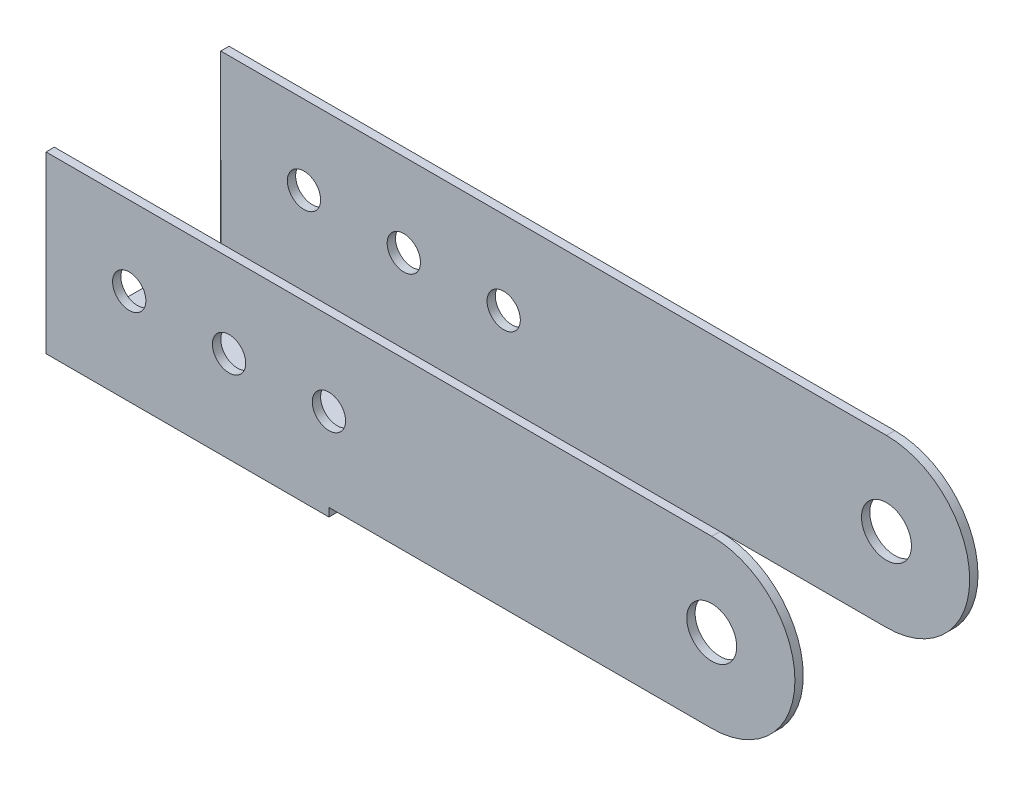
ISO-10303-21;
HEADER;
FILE_DESCRIPTION(('STEP AP214'),'2;1');
FILE_NAME('part.step','',(''),(''),'','','');
FILE_SCHEMA(('AUTOMOTIVE_DESIGN { 1 0 10303 214 1 1 1 1 }'));
ENDSEC;
DATA;
#1=APPLICATION_CONTEXT('core data for automotive mechanical design processes');
#2=APPLICATION_PROTOCOL_DEFINITION('international standard','automotive_design',2000,#1);
#3=PRODUCT_CONTEXT('',#1,'mechanical');
#4=PRODUCT('Part','Part','',(#3));
#5=PRODUCT_RELATED_PRODUCT_CATEGORY('part','',(#4));
#6=PRODUCT_DEFINITION_FORMATION('','',#4);
#7=PRODUCT_DEFINITION_CONTEXT('part definition',#1,'design');
#8=PRODUCT_DEFINITION('design','',#6,#7);
#9=PRODUCT_DEFINITION_SHAPE('','',#8);
#10=(LENGTH_UNIT() NAMED_UNIT(*) SI_UNIT(.MILLI.,.METRE.));
#11=(NAMED_UNIT(*) PLANE_ANGLE_UNIT() SI_UNIT($,.RADIAN.));
#12=(NAMED_UNIT(*) SI_UNIT($,.STERADIAN.) SOLID_ANGLE_UNIT());
#13=UNCERTAINTY_MEASURE_WITH_UNIT(LENGTH_MEASURE(1.E-05),#10,'distance_accuracy_value','');
#14=(GEOMETRIC_REPRESENTATION_CONTEXT(3) GLOBAL_UNCERTAINTY_ASSIGNED_CONTEXT((#13)) GLOBAL_UNIT_ASSIGNED_CONTEXT((#10,
#11,#12)) REPRESENTATION_CONTEXT('',''));
#15=CARTESIAN_POINT('',(0.,0.,0.));
#16=DIRECTION('',(0.,0.,1.));
#17=DIRECTION('',(1.,0.,0.));
#18=AXIS2_PLACEMENT_3D('',#15,#16,#17);
#19=CARTESIAN_POINT('',(-25.,-5.,10.5));
#20=DIRECTION('',(0.,1.,0.));
#21=DIRECTION('',(-1.,0.,0.));
#22=AXIS2_PLACEMENT_3D('',#19,#20,#21);
#23=PLANE('',#22);
#24=DIRECTION('',(0.,0.,1.));
#25=VECTOR('',#24,1.);
#26=CARTESIAN_POINT('',(-8.,-5.,10.5));
#27=LINE('',#26,#25);
#28=CARTESIAN_POINT('',(-8.,-5.,10.));
#29=VERTEX_POINT('',#28);
#30=CARTESIAN_POINT('',(-8.,-5.,10.5));
#31=VERTEX_POINT('',#30);
#32=EDGE_CURVE('E11',#29,#31,#27,.T.);
#33=ORIENTED_EDGE('',*,*,#32,.F.);
#34=DIRECTION('',(1.,0.,0.));
#35=VECTOR('',#34,1.);
#36=CARTESIAN_POINT('',(-25.,-5.,10.));
#37=LINE('',#36,#35);
#38=CARTESIAN_POINT('',(15.,-5.,10.));
#39=VERTEX_POINT('',#38);
#40=EDGE_CURVE('E220',#29,#39,#37,.T.);
#41=ORIENTED_EDGE('',*,*,#40,.T.);
#42=DIRECTION('',(0.,0.,-1.));
#43=VECTOR('',#42,1.);
#44=CARTESIAN_POINT('',(15.,-5.,10.5));
#45=LINE('',#44,#43);
#46=CARTESIAN_POINT('',(15.,-5.,10.5));
#47=VERTEX_POINT('',#46);
#48=EDGE_CURVE('E43',#47,#39,#45,.T.);
#49=ORIENTED_EDGE('',*,*,#48,.F.);
#50=DIRECTION('',(1.,0.,0.));
#51=VECTOR('',#50,1.);
#52=CARTESIAN_POINT('',(-25.,-5.,10.5));
#53=LINE('',#52,#51);
#54=EDGE_CURVE('E50',#31,#47,#53,.T.);
#55=ORIENTED_EDGE('',*,*,#54,.F.);
#56=EDGE_LOOP('',(#33,#41,#49,#55));
#57=FACE_BOUND('',#56,.T.);
#58=ADVANCED_FACE('F35',(#57),#23,.F.);
#59=CARTESIAN_POINT('',(15.,0.,10.5));
#60=DIRECTION('',(0.,0.,1.));
#61=DIRECTION('',(1.,0.,0.));
#62=AXIS2_PLACEMENT_3D('',#59,#60,#61);
#63=PLANE('',#62);
#64=CARTESIAN_POINT('',(-14.,0.,10.5));
#65=DIRECTION('',(0.,0.,1.));
#66=DIRECTION('',(1.,0.,0.));
#67=AXIS2_PLACEMENT_3D('',#64,#65,#66);
#68=CIRCLE('',#67,1.);
#69=CARTESIAN_POINT('',(-13.,0.,10.5));
#70=VERTEX_POINT('',#69);
#71=EDGE_CURVE('E192',#70,#70,#68,.T.);
#72=ORIENTED_EDGE('',*,*,#71,.F.);
#73=EDGE_LOOP('',(#72));
#74=FACE_BOUND('',#73,.T.);
#75=CARTESIAN_POINT('',(15.,0.,10.5));
#76=DIRECTION('',(0.,0.,1.));
#77=DIRECTION('',(1.,0.,0.));
#78=AXIS2_PLACEMENT_3D('',#75,#76,#77);
#79=CIRCLE('',#78,1.5);
#80=CARTESIAN_POINT('',(16.5,0.,10.5));
#81=VERTEX_POINT('',#80);
#82=EDGE_CURVE('E204',#81,#81,#79,.T.);
#83=ORIENTED_EDGE('',*,*,#82,.F.);
#84=EDGE_LOOP('',(#83));
#85=FACE_BOUND('',#84,.T.);
#86=DIRECTION('',(0.,-1.,0.));
#87=VECTOR('',#86,1.);
#88=CARTESIAN_POINT('',(-25.,5.,10.5));
#89=LINE('',#88,#87);
#90=CARTESIAN_POINT('',(-25.,5.,10.5));
#91=VERTEX_POINT('',#90);
#92=CARTESIAN_POINT('',(-25.,-5.5,10.5));
#93=VERTEX_POINT('',#92);
#94=EDGE_CURVE('E210',#91,#93,#89,.T.);
#95=ORIENTED_EDGE('',*,*,#94,.T.);
#96=DIRECTION('',(-1.,0.,0.));
#97=VECTOR('',#96,1.);
#98=CARTESIAN_POINT('',(-25.,-5.5,10.5));
#99=LINE('',#98,#97);
#100=CARTESIAN_POINT('',(-8.,-5.5,10.5));
#101=VERTEX_POINT('',#100);
#102=EDGE_CURVE('E166',#101,#93,#99,.T.);
#103=ORIENTED_EDGE('',*,*,#102,.F.);
#104=DIRECTION('',(0.,1.,0.));
#105=VECTOR('',#104,1.);
#106=CARTESIAN_POINT('',(-8.,-5.5,10.5));
#107=LINE('',#106,#105);
#108=EDGE_CURVE('E182',#101,#31,#107,.T.);
#109=ORIENTED_EDGE('',*,*,#108,.T.);
#110=ORIENTED_EDGE('',*,*,#54,.T.);
#111=CARTESIAN_POINT('',(15.,0.,10.5));
#112=DIRECTION('',(0.,0.,1.));
#113=DIRECTION('',(1.,0.,0.));
#114=AXIS2_PLACEMENT_3D('',#111,#112,#113);
#115=CIRCLE('',#114,5.);
#116=CARTESIAN_POINT('',(15.,5.,10.5));
#117=VERTEX_POINT('',#116);
#118=EDGE_CURVE('E214',#47,#117,#115,.T.);
#119=ORIENTED_EDGE('',*,*,#118,.T.);
#120=DIRECTION('',(-1.,0.,0.));
#121=VECTOR('',#120,1.);
#122=CARTESIAN_POINT('',(15.,5.,10.5));
#123=LINE('',#122,#121);
#124=EDGE_CURVE('E216',#117,#91,#123,.T.);
#125=ORIENTED_EDGE('',*,*,#124,.T.);
#126=EDGE_LOOP('',(#95,#103,#109,#110,#119,#125));
#127=FACE_BOUND('',#126,.T.);
#128=CARTESIAN_POINT('',(-8.,0.,10.5));
#129=DIRECTION('',(0.,0.,1.));
#130=DIRECTION('',(1.,0.,0.));
#131=AXIS2_PLACEMENT_3D('',#128,#129,#130);
#132=CIRCLE('',#131,1.);
#133=CARTESIAN_POINT('',(-7.,0.,10.5));
#134=VERTEX_POINT('',#133);
#135=EDGE_CURVE('E198',#134,#134,#132,.T.);
#136=ORIENTED_EDGE('',*,*,#135,.F.);
#137=EDGE_LOOP('',(#136));
#138=FACE_BOUND('',#137,.T.);
#139=CARTESIAN_POINT('',(-20.,0.253438211378563,10.5));
#140=DIRECTION('',(0.,0.,1.));
#141=DIRECTION('',(1.,0.,0.));
#142=AXIS2_PLACEMENT_3D('',#139,#140,#141);
#143=CIRCLE('',#142,1.);
#144=CARTESIAN_POINT('',(-19.,0.253438211378563,10.5));
#145=VERTEX_POINT('',#144);
#146=EDGE_CURVE('E186',#145,#145,#143,.T.);
#147=ORIENTED_EDGE('',*,*,#146,.F.);
#148=EDGE_LOOP('',(#147));
#149=FACE_BOUND('',#148,.T.);
#150=ADVANCED_FACE('F252',(#74,#85,#127,#138,#149),#63,.T.);
#151=CARTESIAN_POINT('',(15.,0.,10.));
#152=DIRECTION('',(0.,0.,1.));
#153=DIRECTION('',(1.,0.,0.));
#154=AXIS2_PLACEMENT_3D('',#151,#152,#153);
#155=PLANE('',#154);
#156=DIRECTION('',(0.,-1.,0.));
#157=VECTOR('',#156,1.);
#158=CARTESIAN_POINT('',(-25.,5.,10.));
#159=LINE('',#158,#157);
#160=CARTESIAN_POINT('',(-25.,5.,10.));
#161=VERTEX_POINT('',#160);
#162=CARTESIAN_POINT('',(-25.,-5.,10.));
#163=VERTEX_POINT('',#162);
#164=EDGE_CURVE('E207',#161,#163,#159,.T.);
#165=ORIENTED_EDGE('',*,*,#164,.F.);
#166=DIRECTION('',(-1.,0.,0.));
#167=VECTOR('',#166,1.);
#168=CARTESIAN_POINT('',(15.,5.,10.));
#169=LINE('',#168,#167);
#170=CARTESIAN_POINT('',(15.,5.,10.));
#171=VERTEX_POINT('',#170);
#172=EDGE_CURVE('E212',#171,#161,#169,.T.);
#173=ORIENTED_EDGE('',*,*,#172,.F.);
#174=CARTESIAN_POINT('',(15.,0.,10.));
#175=DIRECTION('',(0.,0.,1.));
#176=DIRECTION('',(1.,0.,0.));
#177=AXIS2_PLACEMENT_3D('',#174,#175,#176);
#178=CIRCLE('',#177,5.);
#179=EDGE_CURVE('E224',#39,#171,#178,.T.);
#180=ORIENTED_EDGE('',*,*,#179,.F.);
#181=ORIENTED_EDGE('',*,*,#40,.F.);
#182=EDGE_CURVE('E221',#163,#29,#37,.T.);
#183=ORIENTED_EDGE('',*,*,#182,.F.);
#184=EDGE_LOOP('',(#165,#173,#180,#181,#183));
#185=FACE_BOUND('',#184,.T.);
#186=CARTESIAN_POINT('',(15.,0.,10.));
#187=DIRECTION('',(0.,0.,1.));
#188=DIRECTION('',(1.,0.,0.));
#189=AXIS2_PLACEMENT_3D('',#186,#187,#188);
#190=CIRCLE('',#189,1.5);
#191=CARTESIAN_POINT('',(16.5,0.,10.));
#192=VERTEX_POINT('',#191);
#193=EDGE_CURVE('E201',#192,#192,#190,.T.);
#194=ORIENTED_EDGE('',*,*,#193,.T.);
#195=EDGE_LOOP('',(#194));
#196=FACE_BOUND('',#195,.T.);
#197=CARTESIAN_POINT('',(-8.,0.,10.));
#198=DIRECTION('',(0.,0.,1.));
#199=DIRECTION('',(1.,0.,0.));
#200=AXIS2_PLACEMENT_3D('',#197,#198,#199);
#201=CIRCLE('',#200,1.);
#202=CARTESIAN_POINT('',(-7.,0.,10.));
#203=VERTEX_POINT('',#202);
#204=EDGE_CURVE('E195',#203,#203,#201,.T.);
#205=ORIENTED_EDGE('',*,*,#204,.T.);
#206=EDGE_LOOP('',(#205));
#207=FACE_BOUND('',#206,.T.);
#208=CARTESIAN_POINT('',(-14.,0.,10.));
#209=DIRECTION('',(0.,0.,1.));
#210=DIRECTION('',(1.,0.,0.));
#211=AXIS2_PLACEMENT_3D('',#208,#209,#210);
#212=CIRCLE('',#211,1.);
#213=CARTESIAN_POINT('',(-13.,0.,10.));
#214=VERTEX_POINT('',#213);
#215=EDGE_CURVE('E189',#214,#214,#212,.T.);
#216=ORIENTED_EDGE('',*,*,#215,.T.);
#217=EDGE_LOOP('',(#216));
#218=FACE_BOUND('',#217,.T.);
#219=CARTESIAN_POINT('',(-20.,0.253438211378563,10.));
#220=DIRECTION('',(0.,0.,1.));
#221=DIRECTION('',(1.,0.,0.));
#222=AXIS2_PLACEMENT_3D('',#219,#220,#221);
#223=CIRCLE('',#222,1.);
#224=CARTESIAN_POINT('',(-19.,0.253438211378563,10.));
#225=VERTEX_POINT('',#224);
#226=EDGE_CURVE('E185',#225,#225,#223,.T.);
#227=ORIENTED_EDGE('',*,*,#226,.T.);
#228=EDGE_LOOP('',(#227));
#229=FACE_BOUND('',#228,.T.);
#230=ADVANCED_FACE('F241',(#185,#196,#207,#218,#229),#155,.F.);
#231=CARTESIAN_POINT('',(-25.,5.,10.5));
#232=DIRECTION('',(1.,0.,0.));
#233=DIRECTION('',(0.,0.,-1.));
#234=AXIS2_PLACEMENT_3D('',#231,#232,#233);
#235=PLANE('',#234);
#236=ORIENTED_EDGE('',*,*,#164,.T.);
#237=DIRECTION('',(0.,0.,-1.));
#238=VECTOR('',#237,1.);
#239=CARTESIAN_POINT('',(-25.,-5.,-0.5));
#240=LINE('',#239,#238);
#241=CARTESIAN_POINT('',(-25.,-5.,0.));
#242=VERTEX_POINT('',#241);
#243=EDGE_CURVE('E167',#163,#242,#240,.T.);
#244=ORIENTED_EDGE('',*,*,#243,.T.);
#245=DIRECTION('',(0.,-1.,0.));
#246=VECTOR('',#245,1.);
#247=CARTESIAN_POINT('',(-25.,5.,0.));
#248=LINE('',#247,#246);
#249=CARTESIAN_POINT('',(-25.,5.,0.));
#250=VERTEX_POINT('',#249);
#251=EDGE_CURVE('E159',#250,#242,#248,.T.);
#252=ORIENTED_EDGE('',*,*,#251,.F.);
#253=DIRECTION('',(0.,0.,1.));
#254=VECTOR('',#253,1.);
#255=CARTESIAN_POINT('',(-25.,5.,-0.5));
#256=LINE('',#255,#254);
#257=CARTESIAN_POINT('',(-25.,5.,-0.5));
#258=VERTEX_POINT('',#257);
#259=EDGE_CURVE('E128',#258,#250,#256,.T.);
#260=ORIENTED_EDGE('',*,*,#259,.F.);
#261=DIRECTION('',(0.,1.,0.));
#262=VECTOR('',#261,1.);
#263=CARTESIAN_POINT('',(-25.,-5.5,-0.5));
#264=LINE('',#263,#262);
#265=CARTESIAN_POINT('',(-25.,-5.5,-0.5));
#266=VERTEX_POINT('',#265);
#267=EDGE_CURVE('E138',#266,#258,#264,.T.);
#268=ORIENTED_EDGE('',*,*,#267,.F.);
#269=DIRECTION('',(0.,0.,-1.));
#270=VECTOR('',#269,1.);
#271=CARTESIAN_POINT('',(-25.,-5.5,-0.5));
#272=LINE('',#271,#270);
#273=EDGE_CURVE('E170',#93,#266,#272,.T.);
#274=ORIENTED_EDGE('',*,*,#273,.F.);
#275=ORIENTED_EDGE('',*,*,#94,.F.);
#276=DIRECTION('',(0.,0.,-1.));
#277=VECTOR('',#276,1.);
#278=CARTESIAN_POINT('',(-25.,5.,10.5));
#279=LINE('',#278,#277);
#280=EDGE_CURVE('E218',#91,#161,#279,.T.);
#281=ORIENTED_EDGE('',*,*,#280,.T.);
#282=EDGE_LOOP('',(#236,#244,#252,#260,#268,#274,#275,#281));
#283=FACE_BOUND('',#282,.T.);
#284=ADVANCED_FACE('F37',(#283),#235,.F.);
#285=CARTESIAN_POINT('',(15.,0.,10.5));
#286=DIRECTION('',(0.,0.,-1.));
#287=DIRECTION('',(-1.,0.,0.));
#288=AXIS2_PLACEMENT_3D('',#285,#286,#287);
#289=CYLINDRICAL_SURFACE('',#288,5.);
#290=ORIENTED_EDGE('',*,*,#179,.T.);
#291=DIRECTION('',(0.,0.,-1.));
#292=VECTOR('',#291,1.);
#293=CARTESIAN_POINT('',(15.,5.,10.5));
#294=LINE('',#293,#292);
#295=EDGE_CURVE('E229',#117,#171,#294,.T.);
#296=ORIENTED_EDGE('',*,*,#295,.F.);
#297=ORIENTED_EDGE('',*,*,#118,.F.);
#298=ORIENTED_EDGE('',*,*,#48,.T.);
#299=EDGE_LOOP('',(#290,#296,#297,#298));
#300=FACE_BOUND('',#299,.T.);
#301=ADVANCED_FACE('F235',(#300),#289,.T.);
#302=CARTESIAN_POINT('',(15.,5.,10.5));
#303=DIRECTION('',(0.,-1.,0.));
#304=DIRECTION('',(1.,0.,0.));
#305=AXIS2_PLACEMENT_3D('',#302,#303,#304);
#306=PLANE('',#305);
#307=ORIENTED_EDGE('',*,*,#172,.T.);
#308=ORIENTED_EDGE('',*,*,#280,.F.);
#309=ORIENTED_EDGE('',*,*,#124,.F.);
#310=ORIENTED_EDGE('',*,*,#295,.T.);
#311=EDGE_LOOP('',(#307,#308,#309,#310));
#312=FACE_BOUND('',#311,.T.);
#313=ADVANCED_FACE('F246',(#312),#306,.F.);
#314=CARTESIAN_POINT('',(15.,0.,10.5));
#315=DIRECTION('',(0.,0.,-1.));
#316=DIRECTION('',(-1.,0.,0.));
#317=AXIS2_PLACEMENT_3D('',#314,#315,#316);
#318=CYLINDRICAL_SURFACE('',#317,1.5);
#319=ORIENTED_EDGE('',*,*,#82,.T.);
#320=EDGE_LOOP('',(#319));
#321=FACE_BOUND('',#320,.T.);
#322=ORIENTED_EDGE('',*,*,#193,.F.);
#323=EDGE_LOOP('',(#322));
#324=FACE_BOUND('',#323,.T.);
#325=ADVANCED_FACE('F271',(#321,#324),#318,.F.);
#326=CARTESIAN_POINT('',(-8.,0.,10.5));
#327=DIRECTION('',(0.,0.,-1.));
#328=DIRECTION('',(-1.,0.,0.));
#329=AXIS2_PLACEMENT_3D('',#326,#327,#328);
#330=CYLINDRICAL_SURFACE('',#329,1.);
#331=ORIENTED_EDGE('',*,*,#135,.T.);
#332=EDGE_LOOP('',(#331));
#333=FACE_BOUND('',#332,.T.);
#334=ORIENTED_EDGE('',*,*,#204,.F.);
#335=EDGE_LOOP('',(#334));
#336=FACE_BOUND('',#335,.T.);
#337=ADVANCED_FACE('F276',(#333,#336),#330,.F.);
#338=CARTESIAN_POINT('',(-14.,0.,10.5));
#339=DIRECTION('',(0.,0.,-1.));
#340=DIRECTION('',(-1.,0.,0.));
#341=AXIS2_PLACEMENT_3D('',#338,#339,#340);
#342=CYLINDRICAL_SURFACE('',#341,1.);
#343=ORIENTED_EDGE('',*,*,#71,.T.);
#344=EDGE_LOOP('',(#343));
#345=FACE_BOUND('',#344,.T.);
#346=ORIENTED_EDGE('',*,*,#215,.F.);
#347=EDGE_LOOP('',(#346));
#348=FACE_BOUND('',#347,.T.);
#349=ADVANCED_FACE('F280',(#345,#348),#342,.F.);
#350=CARTESIAN_POINT('',(-20.,0.253438211378563,10.5));
#351=DIRECTION('',(0.,0.,-1.));
#352=DIRECTION('',(-1.,0.,0.));
#353=AXIS2_PLACEMENT_3D('',#350,#351,#352);
#354=CYLINDRICAL_SURFACE('',#353,1.);
#355=ORIENTED_EDGE('',*,*,#146,.T.);
#356=EDGE_LOOP('',(#355));
#357=FACE_BOUND('',#356,.T.);
#358=ORIENTED_EDGE('',*,*,#226,.F.);
#359=EDGE_LOOP('',(#358));
#360=FACE_BOUND('',#359,.T.);
#361=ADVANCED_FACE('F284',(#357,#360),#354,.F.);
#362=CARTESIAN_POINT('',(0.,-5.,0.));
#363=DIRECTION('',(0.,1.,0.));
#364=DIRECTION('',(0.,0.,1.));
#365=AXIS2_PLACEMENT_3D('',#362,#363,#364);
#366=PLANE('',#365);
#367=DIRECTION('',(1.,0.,0.));
#368=VECTOR('',#367,1.);
#369=CARTESIAN_POINT('',(-25.,-5.,0.));
#370=LINE('',#369,#368);
#371=CARTESIAN_POINT('',(-8.,-5.,0.));
#372=VERTEX_POINT('',#371);
#373=EDGE_CURVE('E145',#242,#372,#370,.T.);
#374=ORIENTED_EDGE('',*,*,#373,.F.);
#375=ORIENTED_EDGE('',*,*,#243,.F.);
#376=ORIENTED_EDGE('',*,*,#182,.T.);
#377=DIRECTION('',(0.,0.,1.));
#378=VECTOR('',#377,1.);
#379=CARTESIAN_POINT('',(-8.,-5.,10.5));
#380=LINE('',#379,#378);
#381=EDGE_CURVE('E56',#372,#29,#380,.T.);
#382=ORIENTED_EDGE('',*,*,#381,.F.);
#383=EDGE_LOOP('',(#374,#375,#376,#382));
#384=FACE_BOUND('',#383,.T.);
#385=ADVANCED_FACE('F288',(#384),#366,.T.);
#386=CARTESIAN_POINT('',(-8.,-5.5,10.5));
#387=DIRECTION('',(-1.,0.,0.));
#388=DIRECTION('',(0.,0.,1.));
#389=AXIS2_PLACEMENT_3D('',#386,#387,#388);
#390=PLANE('',#389);
#391=CARTESIAN_POINT('',(-8.,-5.,-0.5));
#392=VERTEX_POINT('',#391);
#393=EDGE_CURVE('E175',#392,#372,#380,.T.);
#394=ORIENTED_EDGE('',*,*,#393,.T.);
#395=ORIENTED_EDGE('',*,*,#381,.T.);
#396=ORIENTED_EDGE('',*,*,#32,.T.);
#397=ORIENTED_EDGE('',*,*,#108,.F.);
#398=DIRECTION('',(0.,0.,1.));
#399=VECTOR('',#398,1.);
#400=CARTESIAN_POINT('',(-8.,-5.5,10.5));
#401=LINE('',#400,#399);
#402=CARTESIAN_POINT('',(-8.,-5.5,-0.5));
#403=VERTEX_POINT('',#402);
#404=EDGE_CURVE('E163',#403,#101,#401,.T.);
#405=ORIENTED_EDGE('',*,*,#404,.F.);
#406=DIRECTION('',(0.,1.,0.));
#407=VECTOR('',#406,1.);
#408=CARTESIAN_POINT('',(-8.,-5.5,-0.5));
#409=LINE('',#408,#407);
#410=EDGE_CURVE('E174',#403,#392,#409,.T.);
#411=ORIENTED_EDGE('',*,*,#410,.T.);
#412=EDGE_LOOP('',(#394,#395,#396,#397,#405,#411));
#413=FACE_BOUND('',#412,.T.);
#414=ADVANCED_FACE('F259',(#413),#390,.F.);
#415=CARTESIAN_POINT('',(-8.,-5.5,-0.5));
#416=DIRECTION('',(0.,0.,1.));
#417=DIRECTION('',(1.,0.,0.));
#418=AXIS2_PLACEMENT_3D('',#415,#416,#417);
#419=PLANE('',#418);
#420=ORIENTED_EDGE('',*,*,#267,.T.);
#421=DIRECTION('',(-1.,0.,0.));
#422=VECTOR('',#421,1.);
#423=CARTESIAN_POINT('',(-25.,5.,-0.5));
#424=LINE('',#423,#422);
#425=CARTESIAN_POINT('',(15.,5.,-0.5));
#426=VERTEX_POINT('',#425);
#427=EDGE_CURVE('E121',#426,#258,#424,.T.);
#428=ORIENTED_EDGE('',*,*,#427,.F.);
#429=CARTESIAN_POINT('',(15.,0.,-0.5));
#430=DIRECTION('',(0.,0.,1.));
#431=DIRECTION('',(1.,0.,0.));
#432=AXIS2_PLACEMENT_3D('',#429,#430,#431);
#433=CIRCLE('',#432,5.);
#434=CARTESIAN_POINT('',(15.,-5.,-0.5));
#435=VERTEX_POINT('',#434);
#436=EDGE_CURVE('E135',#435,#426,#433,.T.);
#437=ORIENTED_EDGE('',*,*,#436,.F.);
#438=DIRECTION('',(1.,0.,0.));
#439=VECTOR('',#438,1.);
#440=CARTESIAN_POINT('',(-25.,-5.,-0.5));
#441=LINE('',#440,#439);
#442=EDGE_CURVE('E129',#392,#435,#441,.T.);
#443=ORIENTED_EDGE('',*,*,#442,.F.);
#444=ORIENTED_EDGE('',*,*,#410,.F.);
#445=DIRECTION('',(1.,0.,0.));
#446=VECTOR('',#445,1.);
#447=CARTESIAN_POINT('',(-8.,-5.5,-0.5));
#448=LINE('',#447,#446);
#449=EDGE_CURVE('E172',#266,#403,#448,.T.);
#450=ORIENTED_EDGE('',*,*,#449,.F.);
#451=EDGE_LOOP('',(#420,#428,#437,#443,#444,#450));
#452=FACE_BOUND('',#451,.T.);
#453=CARTESIAN_POINT('',(-8.,0.,-0.5));
#454=DIRECTION('',(0.,0.,1.));
#455=DIRECTION('',(1.,0.,0.));
#456=AXIS2_PLACEMENT_3D('',#453,#454,#455);
#457=CIRCLE('',#456,1.);
#458=CARTESIAN_POINT('',(-7.,0.,-0.5));
#459=VERTEX_POINT('',#458);
#460=EDGE_CURVE('E331',#459,#459,#457,.T.);
#461=ORIENTED_EDGE('',*,*,#460,.T.);
#462=EDGE_LOOP('',(#461));
#463=FACE_BOUND('',#462,.T.);
#464=CARTESIAN_POINT('',(-14.,0.,-0.5));
#465=DIRECTION('',(0.,0.,1.));
#466=DIRECTION('',(1.,0.,0.));
#467=AXIS2_PLACEMENT_3D('',#464,#465,#466);
#468=CIRCLE('',#467,1.);
#469=CARTESIAN_POINT('',(-13.,0.,-0.5));
#470=VERTEX_POINT('',#469);
#471=EDGE_CURVE('E339',#470,#470,#468,.T.);
#472=ORIENTED_EDGE('',*,*,#471,.T.);
#473=EDGE_LOOP('',(#472));
#474=FACE_BOUND('',#473,.T.);
#475=CARTESIAN_POINT('',(-20.,0.253438211378563,-0.5));
#476=DIRECTION('',(0.,0.,1.));
#477=DIRECTION('',(1.,0.,0.));
#478=AXIS2_PLACEMENT_3D('',#475,#476,#477);
#479=CIRCLE('',#478,1.);
#480=CARTESIAN_POINT('',(-19.,0.253438211378563,-0.5));
#481=VERTEX_POINT('',#480);
#482=EDGE_CURVE('E345',#481,#481,#479,.T.);
#483=ORIENTED_EDGE('',*,*,#482,.T.);
#484=EDGE_LOOP('',(#483));
#485=FACE_BOUND('',#484,.T.);
#486=CARTESIAN_POINT('',(15.,0.,-0.5));
#487=DIRECTION('',(0.,0.,1.));
#488=DIRECTION('',(1.,0.,0.));
#489=AXIS2_PLACEMENT_3D('',#486,#487,#488);
#490=CIRCLE('',#489,1.5);
#491=CARTESIAN_POINT('',(16.5,0.,-0.5));
#492=VERTEX_POINT('',#491);
#493=EDGE_CURVE('E157',#492,#492,#490,.T.);
#494=ORIENTED_EDGE('',*,*,#493,.T.);
#495=EDGE_LOOP('',(#494));
#496=FACE_BOUND('',#495,.T.);
#497=ADVANCED_FACE('F133',(#452,#463,#474,#485,#496),#419,.F.);
#498=CARTESIAN_POINT('',(0.,-5.5,0.));
#499=DIRECTION('',(0.,1.,0.));
#500=DIRECTION('',(0.,0.,1.));
#501=AXIS2_PLACEMENT_3D('',#498,#499,#500);
#502=PLANE('',#501);
#503=ORIENTED_EDGE('',*,*,#404,.T.);
#504=ORIENTED_EDGE('',*,*,#102,.T.);
#505=ORIENTED_EDGE('',*,*,#273,.T.);
#506=ORIENTED_EDGE('',*,*,#449,.T.);
#507=EDGE_LOOP('',(#503,#504,#505,#506));
#508=FACE_BOUND('',#507,.T.);
#509=ADVANCED_FACE('F255',(#508),#502,.F.);
#510=CARTESIAN_POINT('',(-25.,-5.,-0.5));
#511=DIRECTION('',(0.,-1.,0.));
#512=DIRECTION('',(1.,0.,0.));
#513=AXIS2_PLACEMENT_3D('',#510,#511,#512);
#514=PLANE('',#513);
#515=ORIENTED_EDGE('',*,*,#393,.F.);
#516=ORIENTED_EDGE('',*,*,#442,.T.);
#517=DIRECTION('',(0.,0.,1.));
#518=VECTOR('',#517,1.);
#519=CARTESIAN_POINT('',(15.,-5.,-0.5));
#520=LINE('',#519,#518);
#521=CARTESIAN_POINT('',(15.,-5.,0.));
#522=VERTEX_POINT('',#521);
#523=EDGE_CURVE('E144',#435,#522,#520,.T.);
#524=ORIENTED_EDGE('',*,*,#523,.T.);
#525=EDGE_CURVE('E148',#372,#522,#370,.T.);
#526=ORIENTED_EDGE('',*,*,#525,.F.);
#527=EDGE_LOOP('',(#515,#516,#524,#526));
#528=FACE_BOUND('',#527,.T.);
#529=ADVANCED_FACE('F299',(#528),#514,.T.);
#530=CARTESIAN_POINT('',(15.,0.,-0.5));
#531=DIRECTION('',(0.,0.,1.));
#532=DIRECTION('',(1.,0.,0.));
#533=AXIS2_PLACEMENT_3D('',#530,#531,#532);
#534=CYLINDRICAL_SURFACE('',#533,5.);
#535=CARTESIAN_POINT('',(15.,0.,0.));
#536=DIRECTION('',(0.,0.,1.));
#537=DIRECTION('',(1.,0.,0.));
#538=AXIS2_PLACEMENT_3D('',#535,#536,#537);
#539=CIRCLE('',#538,5.);
#540=CARTESIAN_POINT('',(15.,5.,0.));
#541=VERTEX_POINT('',#540);
#542=EDGE_CURVE('E155',#522,#541,#539,.T.);
#543=ORIENTED_EDGE('',*,*,#542,.F.);
#544=ORIENTED_EDGE('',*,*,#523,.F.);
#545=ORIENTED_EDGE('',*,*,#436,.T.);
#546=DIRECTION('',(0.,0.,1.));
#547=VECTOR('',#546,1.);
#548=CARTESIAN_POINT('',(15.,5.,-0.5));
#549=LINE('',#548,#547);
#550=EDGE_CURVE('E118',#426,#541,#549,.T.);
#551=ORIENTED_EDGE('',*,*,#550,.T.);
#552=EDGE_LOOP('',(#543,#544,#545,#551));
#553=FACE_BOUND('',#552,.T.);
#554=ADVANCED_FACE('F142',(#553),#534,.T.);
#555=CARTESIAN_POINT('',(-25.,5.,-0.5));
#556=DIRECTION('',(0.,1.,0.));
#557=DIRECTION('',(-1.,0.,0.));
#558=AXIS2_PLACEMENT_3D('',#555,#556,#557);
#559=PLANE('',#558);
#560=DIRECTION('',(-1.,0.,0.));
#561=VECTOR('',#560,1.);
#562=CARTESIAN_POINT('',(-25.,5.,0.));
#563=LINE('',#562,#561);
#564=EDGE_CURVE('E123',#541,#250,#563,.T.);
#565=ORIENTED_EDGE('',*,*,#564,.F.);
#566=ORIENTED_EDGE('',*,*,#550,.F.);
#567=ORIENTED_EDGE('',*,*,#427,.T.);
#568=ORIENTED_EDGE('',*,*,#259,.T.);
#569=EDGE_LOOP('',(#565,#566,#567,#568));
#570=FACE_BOUND('',#569,.T.);
#571=ADVANCED_FACE('F120',(#570),#559,.T.);
#572=CARTESIAN_POINT('',(15.,0.,0.));
#573=DIRECTION('',(0.,0.,1.));
#574=DIRECTION('',(1.,0.,0.));
#575=AXIS2_PLACEMENT_3D('',#572,#573,#574);
#576=PLANE('',#575);
#577=CARTESIAN_POINT('',(-8.,0.,0.));
#578=DIRECTION('',(0.,0.,1.));
#579=DIRECTION('',(1.,0.,0.));
#580=AXIS2_PLACEMENT_3D('',#577,#578,#579);
#581=CIRCLE('',#580,1.);
#582=CARTESIAN_POINT('',(-7.,0.,0.));
#583=VERTEX_POINT('',#582);
#584=EDGE_CURVE('E334',#583,#583,#581,.T.);
#585=ORIENTED_EDGE('',*,*,#584,.F.);
#586=EDGE_LOOP('',(#585));
#587=FACE_BOUND('',#586,.T.);
#588=CARTESIAN_POINT('',(-14.,0.,0.));
#589=DIRECTION('',(0.,0.,1.));
#590=DIRECTION('',(1.,0.,0.));
#591=AXIS2_PLACEMENT_3D('',#588,#589,#590);
#592=CIRCLE('',#591,1.);
#593=CARTESIAN_POINT('',(-13.,0.,0.));
#594=VERTEX_POINT('',#593);
#595=EDGE_CURVE('E336',#594,#594,#592,.T.);
#596=ORIENTED_EDGE('',*,*,#595,.F.);
#597=EDGE_LOOP('',(#596));
#598=FACE_BOUND('',#597,.T.);
#599=CARTESIAN_POINT('',(-20.,0.253438211378563,0.));
#600=DIRECTION('',(0.,0.,1.));
#601=DIRECTION('',(1.,0.,0.));
#602=AXIS2_PLACEMENT_3D('',#599,#600,#601);
#603=CIRCLE('',#602,1.);
#604=CARTESIAN_POINT('',(-19.,0.253438211378563,0.));
#605=VERTEX_POINT('',#604);
#606=EDGE_CURVE('E342',#605,#605,#603,.T.);
#607=ORIENTED_EDGE('',*,*,#606,.F.);
#608=EDGE_LOOP('',(#607));
#609=FACE_BOUND('',#608,.T.);
#610=CARTESIAN_POINT('',(15.,0.,0.));
#611=DIRECTION('',(0.,0.,1.));
#612=DIRECTION('',(1.,0.,0.));
#613=AXIS2_PLACEMENT_3D('',#610,#611,#612);
#614=CIRCLE('',#613,1.5);
#615=CARTESIAN_POINT('',(16.5,0.,0.));
#616=VERTEX_POINT('',#615);
#617=EDGE_CURVE('E151',#616,#616,#614,.T.);
#618=ORIENTED_EDGE('',*,*,#617,.F.);
#619=EDGE_LOOP('',(#618));
#620=FACE_BOUND('',#619,.T.);
#621=ORIENTED_EDGE('',*,*,#542,.T.);
#622=ORIENTED_EDGE('',*,*,#564,.T.);
#623=ORIENTED_EDGE('',*,*,#251,.T.);
#624=ORIENTED_EDGE('',*,*,#373,.T.);
#625=ORIENTED_EDGE('',*,*,#525,.T.);
#626=EDGE_LOOP('',(#621,#622,#623,#624,#625));
#627=FACE_BOUND('',#626,.T.);
#628=ADVANCED_FACE('F304',(#587,#598,#609,#620,#627),#576,.T.);
#629=CARTESIAN_POINT('',(15.,0.,-0.5));
#630=DIRECTION('',(0.,0.,1.));
#631=DIRECTION('',(1.,0.,0.));
#632=AXIS2_PLACEMENT_3D('',#629,#630,#631);
#633=CYLINDRICAL_SURFACE('',#632,1.5);
#634=ORIENTED_EDGE('',*,*,#493,.F.);
#635=EDGE_LOOP('',(#634));
#636=FACE_BOUND('',#635,.T.);
#637=ORIENTED_EDGE('',*,*,#617,.T.);
#638=EDGE_LOOP('',(#637));
#639=FACE_BOUND('',#638,.T.);
#640=ADVANCED_FACE('F310',(#636,#639),#633,.F.);
#641=CARTESIAN_POINT('',(-20.,0.253438211378563,-0.5));
#642=DIRECTION('',(0.,0.,1.));
#643=DIRECTION('',(1.,0.,0.));
#644=AXIS2_PLACEMENT_3D('',#641,#642,#643);
#645=CYLINDRICAL_SURFACE('',#644,1.);
#646=ORIENTED_EDGE('',*,*,#482,.F.);
#647=EDGE_LOOP('',(#646));
#648=FACE_BOUND('',#647,.T.);
#649=ORIENTED_EDGE('',*,*,#606,.T.);
#650=EDGE_LOOP('',(#649));
#651=FACE_BOUND('',#650,.T.);
#652=ADVANCED_FACE('F314',(#648,#651),#645,.F.);
#653=CARTESIAN_POINT('',(-14.,0.,-0.5));
#654=DIRECTION('',(0.,0.,1.));
#655=DIRECTION('',(1.,0.,0.));
#656=AXIS2_PLACEMENT_3D('',#653,#654,#655);
#657=CYLINDRICAL_SURFACE('',#656,1.);
#658=ORIENTED_EDGE('',*,*,#471,.F.);
#659=EDGE_LOOP('',(#658));
#660=FACE_BOUND('',#659,.T.);
#661=ORIENTED_EDGE('',*,*,#595,.T.);
#662=EDGE_LOOP('',(#661));
#663=FACE_BOUND('',#662,.T.);
#664=ADVANCED_FACE('F318',(#660,#663),#657,.F.);
#665=CARTESIAN_POINT('',(-8.,0.,-0.5));
#666=DIRECTION('',(0.,0.,1.));
#667=DIRECTION('',(1.,0.,0.));
#668=AXIS2_PLACEMENT_3D('',#665,#666,#667);
#669=CYLINDRICAL_SURFACE('',#668,1.);
#670=ORIENTED_EDGE('',*,*,#460,.F.);
#671=EDGE_LOOP('',(#670));
#672=FACE_BOUND('',#671,.T.);
#673=ORIENTED_EDGE('',*,*,#584,.T.);
#674=EDGE_LOOP('',(#673));
#675=FACE_BOUND('',#674,.T.);
#676=ADVANCED_FACE('F322',(#672,#675),#669,.F.);
#677=CLOSED_SHELL('',(#58,#150,#230,#284,#301,#313,#325,#337,#349,#361,#385,#414,#497,#509,#529,
#554,#571,#628,#640,#652,#664,#676));
#678=MANIFOLD_SOLID_BREP('B2',#677);
#679=ADVANCED_BREP_SHAPE_REPRESENTATION('',(#18,#678),#14);
#680=SHAPE_DEFINITION_REPRESENTATION(#9,#679);
ENDSEC;
END-ISO-10303-21;
